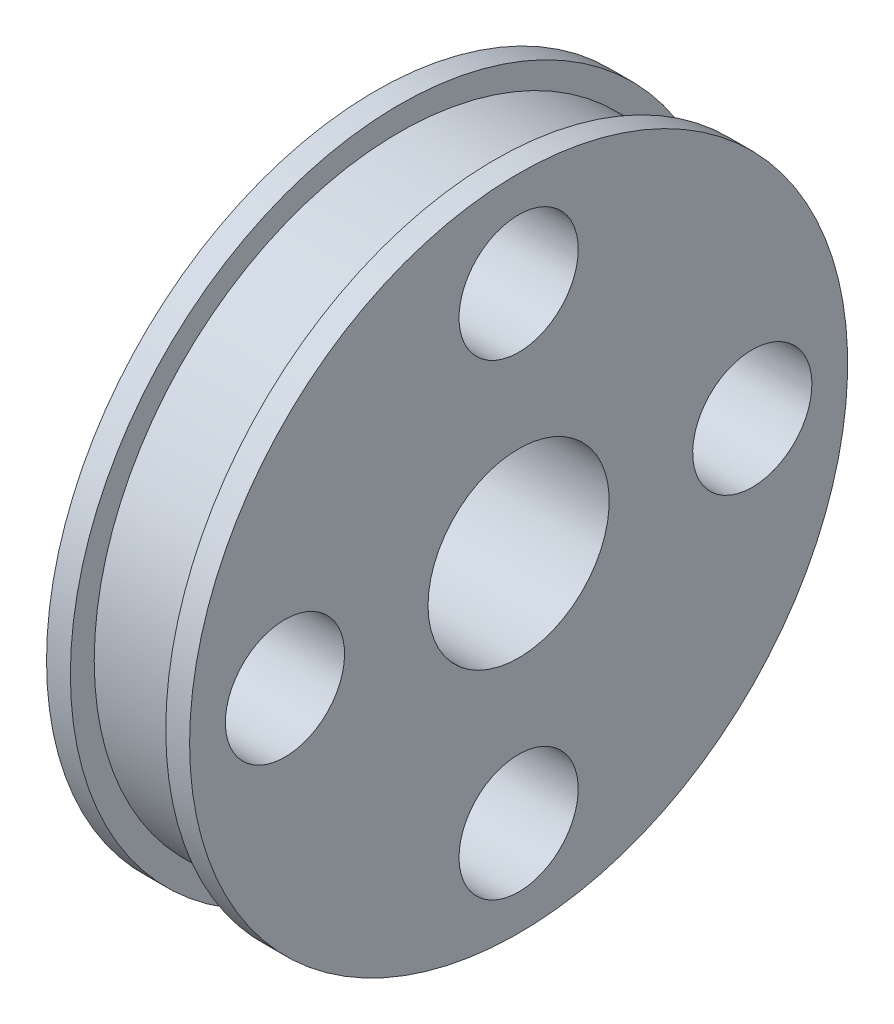
ISO-10303-21;
HEADER;
FILE_DESCRIPTION(('STEP AP214'),'2;1');
FILE_NAME('part.step','',(''),(''),'','','');
FILE_SCHEMA(('AUTOMOTIVE_DESIGN { 1 0 10303 214 1 1 1 1 }'));
ENDSEC;
DATA;
#1=APPLICATION_CONTEXT('core data for automotive mechanical design processes');
#2=APPLICATION_PROTOCOL_DEFINITION('international standard','automotive_design',2000,#1);
#3=PRODUCT_CONTEXT('',#1,'mechanical');
#4=PRODUCT('Part','Part','',(#3));
#5=PRODUCT_RELATED_PRODUCT_CATEGORY('part','',(#4));
#6=PRODUCT_DEFINITION_FORMATION('','',#4);
#7=PRODUCT_DEFINITION_CONTEXT('part definition',#1,'design');
#8=PRODUCT_DEFINITION('design','',#6,#7);
#9=PRODUCT_DEFINITION_SHAPE('','',#8);
#10=(LENGTH_UNIT() NAMED_UNIT(*) SI_UNIT(.MILLI.,.METRE.));
#11=(NAMED_UNIT(*) PLANE_ANGLE_UNIT() SI_UNIT($,.RADIAN.));
#12=(NAMED_UNIT(*) SI_UNIT($,.STERADIAN.) SOLID_ANGLE_UNIT());
#13=UNCERTAINTY_MEASURE_WITH_UNIT(LENGTH_MEASURE(1.E-05),#10,'distance_accuracy_value','');
#14=(GEOMETRIC_REPRESENTATION_CONTEXT(3) GLOBAL_UNCERTAINTY_ASSIGNED_CONTEXT((#13)) GLOBAL_UNIT_ASSIGNED_CONTEXT((#10,
#11,#12)) REPRESENTATION_CONTEXT('',''));
#15=CARTESIAN_POINT('',(0.,0.,0.));
#16=DIRECTION('',(0.,0.,1.));
#17=DIRECTION('',(1.,0.,0.));
#18=AXIS2_PLACEMENT_3D('',#15,#16,#17);
#19=CARTESIAN_POINT('',(0.,50.,0.));
#20=DIRECTION('',(1.,0.,0.));
#21=DIRECTION('',(0.,0.,-1.));
#22=AXIS2_PLACEMENT_3D('',#19,#20,#21);
#23=PLANE('',#22);
#24=CARTESIAN_POINT('',(0.,-19.0000000000002,-49.));
#25=DIRECTION('',(1.,0.,0.));
#26=DIRECTION('',(0.,-1.,0.));
#27=AXIS2_PLACEMENT_3D('',#24,#25,#26);
#28=CIRCLE('',#27,12.5);
#29=CARTESIAN_POINT('',(0.,-31.5000000000002,-49.));
#30=VERTEX_POINT('',#29);
#31=EDGE_CURVE('E87',#30,#30,#28,.T.);
#32=ORIENTED_EDGE('',*,*,#31,.T.);
#33=EDGE_LOOP('',(#32));
#34=FACE_BOUND('',#33,.T.);
#35=CARTESIAN_POINT('',(0.,-68.,0.));
#36=DIRECTION('',(1.,0.,0.));
#37=DIRECTION('',(0.,0.,1.));
#38=AXIS2_PLACEMENT_3D('',#35,#36,#37);
#39=CIRCLE('',#38,12.5);
#40=CARTESIAN_POINT('',(0.,-68.,12.5));
#41=VERTEX_POINT('',#40);
#42=EDGE_CURVE('E80',#41,#41,#39,.T.);
#43=ORIENTED_EDGE('',*,*,#42,.T.);
#44=EDGE_LOOP('',(#43));
#45=FACE_BOUND('',#44,.T.);
#46=CARTESIAN_POINT('',(0.,-18.9999999999995,49.));
#47=DIRECTION('',(1.,0.,0.));
#48=DIRECTION('',(0.,1.,0.));
#49=AXIS2_PLACEMENT_3D('',#46,#47,#48);
#50=CIRCLE('',#49,12.5);
#51=CARTESIAN_POINT('',(0.,-6.49999999999949,48.9999999999999));
#52=VERTEX_POINT('',#51);
#53=EDGE_CURVE('E81',#52,#52,#50,.T.);
#54=ORIENTED_EDGE('',*,*,#53,.T.);
#55=EDGE_LOOP('',(#54));
#56=FACE_BOUND('',#55,.T.);
#57=CARTESIAN_POINT('',(0.,30.,0.));
#58=DIRECTION('',(1.,0.,0.));
#59=DIRECTION('',(0.,0.,-1.));
#60=AXIS2_PLACEMENT_3D('',#57,#58,#59);
#61=CIRCLE('',#60,12.5);
#62=CARTESIAN_POINT('',(0.,30.,-12.5));
#63=VERTEX_POINT('',#62);
#64=EDGE_CURVE('E70',#63,#63,#61,.T.);
#65=ORIENTED_EDGE('',*,*,#64,.T.);
#66=EDGE_LOOP('',(#65));
#67=FACE_BOUND('',#66,.T.);
#68=CARTESIAN_POINT('',(0.,-19.,0.));
#69=DIRECTION('',(-1.,0.,0.));
#70=DIRECTION('',(0.,0.,1.));
#71=AXIS2_PLACEMENT_3D('',#68,#69,#70);
#72=CIRCLE('',#71,19.);
#73=CARTESIAN_POINT('',(0.,-19.,19.));
#74=VERTEX_POINT('',#73);
#75=EDGE_CURVE('E10',#74,#74,#72,.T.);
#76=ORIENTED_EDGE('',*,*,#75,.F.);
#77=EDGE_LOOP('',(#76));
#78=FACE_BOUND('',#77,.T.);
#79=CARTESIAN_POINT('',(0.,-19.,0.));
#80=DIRECTION('',(-1.,0.,0.));
#81=DIRECTION('',(0.,0.,1.));
#82=AXIS2_PLACEMENT_3D('',#79,#80,#81);
#83=CIRCLE('',#82,69.);
#84=CARTESIAN_POINT('',(0.,-19.,69.));
#85=VERTEX_POINT('',#84);
#86=EDGE_CURVE('E67',#85,#85,#83,.T.);
#87=ORIENTED_EDGE('',*,*,#86,.T.);
#88=EDGE_LOOP('',(#87));
#89=FACE_BOUND('',#88,.T.);
#90=ADVANCED_FACE('F39',(#34,#45,#56,#67,#78,#89),#23,.F.);
#91=CARTESIAN_POINT('',(-128.929006020238,-19.,0.));
#92=DIRECTION('',(-1.,0.,0.));
#93=DIRECTION('',(0.,0.,1.));
#94=AXIS2_PLACEMENT_3D('',#91,#92,#93);
#95=CYLINDRICAL_SURFACE('',#94,19.);
#96=CARTESIAN_POINT('',(30.,-19.,0.));
#97=DIRECTION('',(-1.,0.,0.));
#98=DIRECTION('',(0.,0.,1.));
#99=AXIS2_PLACEMENT_3D('',#96,#97,#98);
#100=CIRCLE('',#99,19.);
#101=CARTESIAN_POINT('',(30.,-19.,19.));
#102=VERTEX_POINT('',#101);
#103=EDGE_CURVE('E45',#102,#102,#100,.T.);
#104=ORIENTED_EDGE('',*,*,#103,.F.);
#105=EDGE_LOOP('',(#104));
#106=FACE_BOUND('',#105,.T.);
#107=ORIENTED_EDGE('',*,*,#75,.T.);
#108=EDGE_LOOP('',(#107));
#109=FACE_BOUND('',#108,.T.);
#110=ADVANCED_FACE('F108',(#106,#109),#95,.F.);
#111=CARTESIAN_POINT('',(30.,0.,0.));
#112=DIRECTION('',(-1.,0.,0.));
#113=DIRECTION('',(0.,0.,1.));
#114=AXIS2_PLACEMENT_3D('',#111,#112,#113);
#115=PLANE('',#114);
#116=CARTESIAN_POINT('',(30.,-19.0000000000002,-49.));
#117=DIRECTION('',(1.,0.,0.));
#118=DIRECTION('',(0.,-1.,0.));
#119=AXIS2_PLACEMENT_3D('',#116,#117,#118);
#120=CIRCLE('',#119,12.5);
#121=CARTESIAN_POINT('',(30.,-31.5000000000002,-49.));
#122=VERTEX_POINT('',#121);
#123=EDGE_CURVE('E74',#122,#122,#120,.T.);
#124=ORIENTED_EDGE('',*,*,#123,.F.);
#125=EDGE_LOOP('',(#124));
#126=FACE_BOUND('',#125,.T.);
#127=CARTESIAN_POINT('',(30.,-68.,0.));
#128=DIRECTION('',(1.,0.,0.));
#129=DIRECTION('',(0.,0.,1.));
#130=AXIS2_PLACEMENT_3D('',#127,#128,#129);
#131=CIRCLE('',#130,12.5);
#132=CARTESIAN_POINT('',(30.,-68.,12.5));
#133=VERTEX_POINT('',#132);
#134=EDGE_CURVE('E84',#133,#133,#131,.T.);
#135=ORIENTED_EDGE('',*,*,#134,.F.);
#136=EDGE_LOOP('',(#135));
#137=FACE_BOUND('',#136,.T.);
#138=CARTESIAN_POINT('',(30.,-18.9999999999995,49.));
#139=DIRECTION('',(1.,0.,0.));
#140=DIRECTION('',(0.,1.,0.));
#141=AXIS2_PLACEMENT_3D('',#138,#139,#140);
#142=CIRCLE('',#141,12.5);
#143=CARTESIAN_POINT('',(30.,-6.49999999999949,48.9999999999999));
#144=VERTEX_POINT('',#143);
#145=EDGE_CURVE('E77',#144,#144,#142,.T.);
#146=ORIENTED_EDGE('',*,*,#145,.F.);
#147=EDGE_LOOP('',(#146));
#148=FACE_BOUND('',#147,.T.);
#149=CARTESIAN_POINT('',(30.,30.,0.));
#150=DIRECTION('',(1.,0.,0.));
#151=DIRECTION('',(0.,0.,-1.));
#152=AXIS2_PLACEMENT_3D('',#149,#150,#151);
#153=CIRCLE('',#152,12.5);
#154=CARTESIAN_POINT('',(30.,30.,-12.5));
#155=VERTEX_POINT('',#154);
#156=EDGE_CURVE('E71',#155,#155,#153,.T.);
#157=ORIENTED_EDGE('',*,*,#156,.F.);
#158=EDGE_LOOP('',(#157));
#159=FACE_BOUND('',#158,.T.);
#160=CARTESIAN_POINT('',(30.,-19.,0.));
#161=DIRECTION('',(-1.,0.,0.));
#162=DIRECTION('',(0.,0.,1.));
#163=AXIS2_PLACEMENT_3D('',#160,#161,#162);
#164=CIRCLE('',#163,69.);
#165=CARTESIAN_POINT('',(30.,-19.,69.));
#166=VERTEX_POINT('',#165);
#167=EDGE_CURVE('E49',#166,#166,#164,.T.);
#168=ORIENTED_EDGE('',*,*,#167,.F.);
#169=EDGE_LOOP('',(#168));
#170=FACE_BOUND('',#169,.T.);
#171=ORIENTED_EDGE('',*,*,#103,.T.);
#172=EDGE_LOOP('',(#171));
#173=FACE_BOUND('',#172,.T.);
#174=ADVANCED_FACE('F104',(#126,#137,#148,#159,#170,#173),#115,.F.);
#175=CARTESIAN_POINT('',(-128.929006020238,-19.,0.));
#176=DIRECTION('',(-1.,0.,0.));
#177=DIRECTION('',(0.,0.,1.));
#178=AXIS2_PLACEMENT_3D('',#175,#176,#177);
#179=CYLINDRICAL_SURFACE('',#178,69.);
#180=CARTESIAN_POINT('',(25.,-19.,0.));
#181=DIRECTION('',(-1.,0.,0.));
#182=DIRECTION('',(0.,0.,1.));
#183=AXIS2_PLACEMENT_3D('',#180,#181,#182);
#184=CIRCLE('',#183,69.);
#185=CARTESIAN_POINT('',(25.,-19.,69.));
#186=VERTEX_POINT('',#185);
#187=EDGE_CURVE('E53',#186,#186,#184,.T.);
#188=ORIENTED_EDGE('',*,*,#187,.F.);
#189=EDGE_LOOP('',(#188));
#190=FACE_BOUND('',#189,.T.);
#191=ORIENTED_EDGE('',*,*,#167,.T.);
#192=EDGE_LOOP('',(#191));
#193=FACE_BOUND('',#192,.T.);
#194=ADVANCED_FACE('F107',(#190,#193),#179,.T.);
#195=CARTESIAN_POINT('',(25.,50.,0.));
#196=DIRECTION('',(1.,0.,0.));
#197=DIRECTION('',(0.,0.,-1.));
#198=AXIS2_PLACEMENT_3D('',#195,#196,#197);
#199=PLANE('',#198);
#200=CARTESIAN_POINT('',(25.,-19.,0.));
#201=DIRECTION('',(-1.,0.,0.));
#202=DIRECTION('',(0.,0.,1.));
#203=AXIS2_PLACEMENT_3D('',#200,#201,#202);
#204=CIRCLE('',#203,64.);
#205=CARTESIAN_POINT('',(25.,-19.,64.));
#206=VERTEX_POINT('',#205);
#207=EDGE_CURVE('E58',#206,#206,#204,.T.);
#208=ORIENTED_EDGE('',*,*,#207,.F.);
#209=EDGE_LOOP('',(#208));
#210=FACE_BOUND('',#209,.T.);
#211=ORIENTED_EDGE('',*,*,#187,.T.);
#212=EDGE_LOOP('',(#211));
#213=FACE_BOUND('',#212,.T.);
#214=ADVANCED_FACE('F119',(#210,#213),#199,.F.);
#215=CARTESIAN_POINT('',(-128.929006020238,-19.,0.));
#216=DIRECTION('',(-1.,0.,0.));
#217=DIRECTION('',(0.,0.,1.));
#218=AXIS2_PLACEMENT_3D('',#215,#216,#217);
#219=CYLINDRICAL_SURFACE('',#218,64.);
#220=CARTESIAN_POINT('',(5.,-19.,0.));
#221=DIRECTION('',(-1.,0.,0.));
#222=DIRECTION('',(0.,0.,1.));
#223=AXIS2_PLACEMENT_3D('',#220,#221,#222);
#224=CIRCLE('',#223,64.);
#225=CARTESIAN_POINT('',(5.,-19.,64.));
#226=VERTEX_POINT('',#225);
#227=EDGE_CURVE('E61',#226,#226,#224,.T.);
#228=ORIENTED_EDGE('',*,*,#227,.F.);
#229=EDGE_LOOP('',(#228));
#230=FACE_BOUND('',#229,.T.);
#231=ORIENTED_EDGE('',*,*,#207,.T.);
#232=EDGE_LOOP('',(#231));
#233=FACE_BOUND('',#232,.T.);
#234=ADVANCED_FACE('F126',(#230,#233),#219,.T.);
#235=CARTESIAN_POINT('',(5.,45.,0.));
#236=DIRECTION('',(-1.,0.,0.));
#237=DIRECTION('',(0.,0.,1.));
#238=AXIS2_PLACEMENT_3D('',#235,#236,#237);
#239=PLANE('',#238);
#240=CARTESIAN_POINT('',(5.,-19.,0.));
#241=DIRECTION('',(-1.,0.,0.));
#242=DIRECTION('',(0.,0.,1.));
#243=AXIS2_PLACEMENT_3D('',#240,#241,#242);
#244=CIRCLE('',#243,69.);
#245=CARTESIAN_POINT('',(5.,-19.,69.));
#246=VERTEX_POINT('',#245);
#247=EDGE_CURVE('E64',#246,#246,#244,.T.);
#248=ORIENTED_EDGE('',*,*,#247,.F.);
#249=EDGE_LOOP('',(#248));
#250=FACE_BOUND('',#249,.T.);
#251=ORIENTED_EDGE('',*,*,#227,.T.);
#252=EDGE_LOOP('',(#251));
#253=FACE_BOUND('',#252,.T.);
#254=ADVANCED_FACE('F167',(#250,#253),#239,.F.);
#255=CARTESIAN_POINT('',(-128.929006020238,-19.,0.));
#256=DIRECTION('',(-1.,0.,0.));
#257=DIRECTION('',(0.,0.,1.));
#258=AXIS2_PLACEMENT_3D('',#255,#256,#257);
#259=CYLINDRICAL_SURFACE('',#258,69.);
#260=ORIENTED_EDGE('',*,*,#86,.F.);
#261=EDGE_LOOP('',(#260));
#262=FACE_BOUND('',#261,.T.);
#263=ORIENTED_EDGE('',*,*,#247,.T.);
#264=EDGE_LOOP('',(#263));
#265=FACE_BOUND('',#264,.T.);
#266=ADVANCED_FACE('F177',(#262,#265),#259,.T.);
#267=CARTESIAN_POINT('',(0.,30.,0.));
#268=DIRECTION('',(1.,0.,0.));
#269=DIRECTION('',(0.,0.,-1.));
#270=AXIS2_PLACEMENT_3D('',#267,#268,#269);
#271=CYLINDRICAL_SURFACE('',#270,12.5);
#272=ORIENTED_EDGE('',*,*,#64,.F.);
#273=EDGE_LOOP('',(#272));
#274=FACE_BOUND('',#273,.T.);
#275=ORIENTED_EDGE('',*,*,#156,.T.);
#276=EDGE_LOOP('',(#275));
#277=FACE_BOUND('',#276,.T.);
#278=ADVANCED_FACE('F187',(#274,#277),#271,.F.);
#279=CARTESIAN_POINT('',(0.,-18.9999999999995,49.));
#280=DIRECTION('',(1.,0.,0.));
#281=DIRECTION('',(0.,1.,0.));
#282=AXIS2_PLACEMENT_3D('',#279,#280,#281);
#283=CYLINDRICAL_SURFACE('',#282,12.5);
#284=ORIENTED_EDGE('',*,*,#53,.F.);
#285=EDGE_LOOP('',(#284));
#286=FACE_BOUND('',#285,.T.);
#287=ORIENTED_EDGE('',*,*,#145,.T.);
#288=EDGE_LOOP('',(#287));
#289=FACE_BOUND('',#288,.T.);
#290=ADVANCED_FACE('F196',(#286,#289),#283,.F.);
#291=CARTESIAN_POINT('',(0.,-68.,0.));
#292=DIRECTION('',(1.,0.,0.));
#293=DIRECTION('',(0.,0.,1.));
#294=AXIS2_PLACEMENT_3D('',#291,#292,#293);
#295=CYLINDRICAL_SURFACE('',#294,12.5);
#296=ORIENTED_EDGE('',*,*,#42,.F.);
#297=EDGE_LOOP('',(#296));
#298=FACE_BOUND('',#297,.T.);
#299=ORIENTED_EDGE('',*,*,#134,.T.);
#300=EDGE_LOOP('',(#299));
#301=FACE_BOUND('',#300,.T.);
#302=ADVANCED_FACE('F100',(#298,#301),#295,.F.);
#303=CARTESIAN_POINT('',(0.,-19.0000000000002,-49.));
#304=DIRECTION('',(1.,0.,0.));
#305=DIRECTION('',(0.,-1.,0.));
#306=AXIS2_PLACEMENT_3D('',#303,#304,#305);
#307=CYLINDRICAL_SURFACE('',#306,12.5);
#308=ORIENTED_EDGE('',*,*,#31,.F.);
#309=EDGE_LOOP('',(#308));
#310=FACE_BOUND('',#309,.T.);
#311=ORIENTED_EDGE('',*,*,#123,.T.);
#312=EDGE_LOOP('',(#311));
#313=FACE_BOUND('',#312,.T.);
#314=ADVANCED_FACE('F97',(#310,#313),#307,.F.);
#315=CLOSED_SHELL('',(#90,#110,#174,#194,#214,#234,#254,#266,#278,#290,#302,#314));
#316=MANIFOLD_SOLID_BREP('B2',#315);
#317=ADVANCED_BREP_SHAPE_REPRESENTATION('',(#18,#316),#14);
#318=SHAPE_DEFINITION_REPRESENTATION(#9,#317);
ENDSEC;
END-ISO-10303-21;
